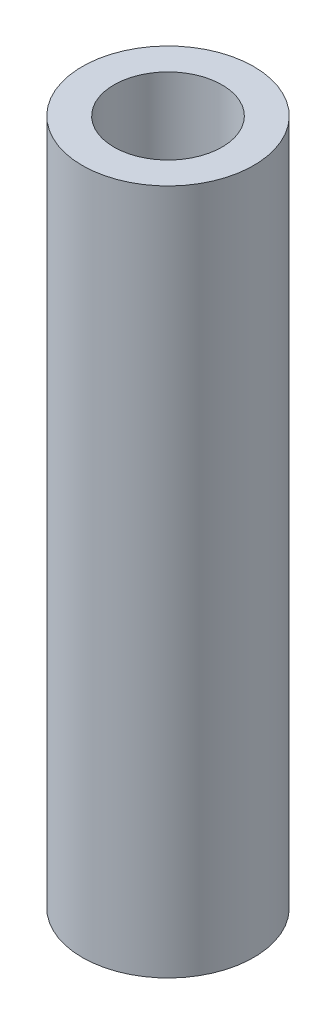
ISO-10303-21;
HEADER;
FILE_DESCRIPTION(('STEP AP214'),'2;1');
FILE_NAME('part.step','',(''),(''),'','','');
FILE_SCHEMA(('AUTOMOTIVE_DESIGN { 1 0 10303 214 1 1 1 1 }'));
ENDSEC;
DATA;
#1=APPLICATION_CONTEXT('core data for automotive mechanical design processes');
#2=APPLICATION_PROTOCOL_DEFINITION('international standard','automotive_design',2000,#1);
#3=PRODUCT_CONTEXT('',#1,'mechanical');
#4=PRODUCT('Part','Part','',(#3));
#5=PRODUCT_RELATED_PRODUCT_CATEGORY('part','',(#4));
#6=PRODUCT_DEFINITION_FORMATION('','',#4);
#7=PRODUCT_DEFINITION_CONTEXT('part definition',#1,'design');
#8=PRODUCT_DEFINITION('design','',#6,#7);
#9=PRODUCT_DEFINITION_SHAPE('','',#8);
#10=(LENGTH_UNIT() NAMED_UNIT(*) SI_UNIT(.MILLI.,.METRE.));
#11=(NAMED_UNIT(*) PLANE_ANGLE_UNIT() SI_UNIT($,.RADIAN.));
#12=(NAMED_UNIT(*) SI_UNIT($,.STERADIAN.) SOLID_ANGLE_UNIT());
#13=UNCERTAINTY_MEASURE_WITH_UNIT(LENGTH_MEASURE(1.E-05),#10,'distance_accuracy_value','');
#14=(GEOMETRIC_REPRESENTATION_CONTEXT(3) GLOBAL_UNCERTAINTY_ASSIGNED_CONTEXT((#13)) GLOBAL_UNIT_ASSIGNED_CONTEXT((#10,
#11,#12)) REPRESENTATION_CONTEXT('',''));
#15=CARTESIAN_POINT('',(0.,0.,0.));
#16=DIRECTION('',(0.,0.,1.));
#17=DIRECTION('',(1.,0.,0.));
#18=AXIS2_PLACEMENT_3D('',#15,#16,#17);
#19=CARTESIAN_POINT('',(0.,-25.4,0.));
#20=DIRECTION('',(0.,1.,0.));
#21=DIRECTION('',(0.,0.,1.));
#22=AXIS2_PLACEMENT_3D('',#19,#20,#21);
#23=CYLINDRICAL_SURFACE('',#22,3.175);
#24=CARTESIAN_POINT('',(0.,-25.4,0.));
#25=DIRECTION('',(0.,1.,0.));
#26=DIRECTION('',(0.,0.,1.));
#27=AXIS2_PLACEMENT_3D('',#24,#25,#26);
#28=CIRCLE('',#27,3.175);
#29=CARTESIAN_POINT('',(0.,-25.4,3.175));
#30=VERTEX_POINT('',#29);
#31=EDGE_CURVE('E10',#30,#30,#28,.T.);
#32=ORIENTED_EDGE('',*,*,#31,.T.);
#33=EDGE_LOOP('',(#32));
#34=FACE_BOUND('',#33,.T.);
#35=CARTESIAN_POINT('',(0.,0.,0.));
#36=DIRECTION('',(0.,1.,0.));
#37=DIRECTION('',(0.,0.,1.));
#38=AXIS2_PLACEMENT_3D('',#35,#36,#37);
#39=CIRCLE('',#38,3.175);
#40=CARTESIAN_POINT('',(0.,0.,3.175));
#41=VERTEX_POINT('',#40);
#42=EDGE_CURVE('E44',#41,#41,#39,.T.);
#43=ORIENTED_EDGE('',*,*,#42,.F.);
#44=EDGE_LOOP('',(#43));
#45=FACE_BOUND('',#44,.T.);
#46=ADVANCED_FACE('F41',(#34,#45),#23,.T.);
#47=CARTESIAN_POINT('',(0.,-25.4,0.));
#48=DIRECTION('',(0.,1.,0.));
#49=DIRECTION('',(0.,0.,1.));
#50=AXIS2_PLACEMENT_3D('',#47,#48,#49);
#51=PLANE('',#50);
#52=CARTESIAN_POINT('',(0.,-25.4,0.));
#53=DIRECTION('',(0.,1.,0.));
#54=DIRECTION('',(0.,0.,1.));
#55=AXIS2_PLACEMENT_3D('',#52,#53,#54);
#56=CIRCLE('',#55,2.);
#57=CARTESIAN_POINT('',(0.,-25.4,2.));
#58=VERTEX_POINT('',#57);
#59=EDGE_CURVE('E51',#58,#58,#56,.T.);
#60=ORIENTED_EDGE('',*,*,#59,.T.);
#61=EDGE_LOOP('',(#60));
#62=FACE_BOUND('',#61,.T.);
#63=ORIENTED_EDGE('',*,*,#31,.F.);
#64=EDGE_LOOP('',(#63));
#65=FACE_BOUND('',#64,.T.);
#66=ADVANCED_FACE('F59',(#62,#65),#51,.F.);
#67=CARTESIAN_POINT('',(0.,0.,0.));
#68=DIRECTION('',(0.,1.,0.));
#69=DIRECTION('',(0.,0.,1.));
#70=AXIS2_PLACEMENT_3D('',#67,#68,#69);
#71=PLANE('',#70);
#72=CARTESIAN_POINT('',(0.,0.,0.));
#73=DIRECTION('',(0.,1.,0.));
#74=DIRECTION('',(0.,0.,1.));
#75=AXIS2_PLACEMENT_3D('',#72,#73,#74);
#76=CIRCLE('',#75,2.);
#77=CARTESIAN_POINT('',(0.,0.,2.));
#78=VERTEX_POINT('',#77);
#79=EDGE_CURVE('E53',#78,#78,#76,.T.);
#80=ORIENTED_EDGE('',*,*,#79,.F.);
#81=EDGE_LOOP('',(#80));
#82=FACE_BOUND('',#81,.T.);
#83=ORIENTED_EDGE('',*,*,#42,.T.);
#84=EDGE_LOOP('',(#83));
#85=FACE_BOUND('',#84,.T.);
#86=ADVANCED_FACE('F65',(#82,#85),#71,.T.);
#87=CARTESIAN_POINT('',(0.,-25.4,0.));
#88=DIRECTION('',(0.,1.,0.));
#89=DIRECTION('',(0.,0.,1.));
#90=AXIS2_PLACEMENT_3D('',#87,#88,#89);
#91=CYLINDRICAL_SURFACE('',#90,2.);
#92=ORIENTED_EDGE('',*,*,#59,.F.);
#93=EDGE_LOOP('',(#92));
#94=FACE_BOUND('',#93,.T.);
#95=ORIENTED_EDGE('',*,*,#79,.T.);
#96=EDGE_LOOP('',(#95));
#97=FACE_BOUND('',#96,.T.);
#98=ADVANCED_FACE('F62',(#94,#97),#91,.F.);
#99=CLOSED_SHELL('',(#46,#66,#86,#98));
#100=MANIFOLD_SOLID_BREP('B2',#99);
#101=ADVANCED_BREP_SHAPE_REPRESENTATION('',(#18,#100),#14);
#102=SHAPE_DEFINITION_REPRESENTATION(#9,#101);
ENDSEC;
END-ISO-10303-21;
